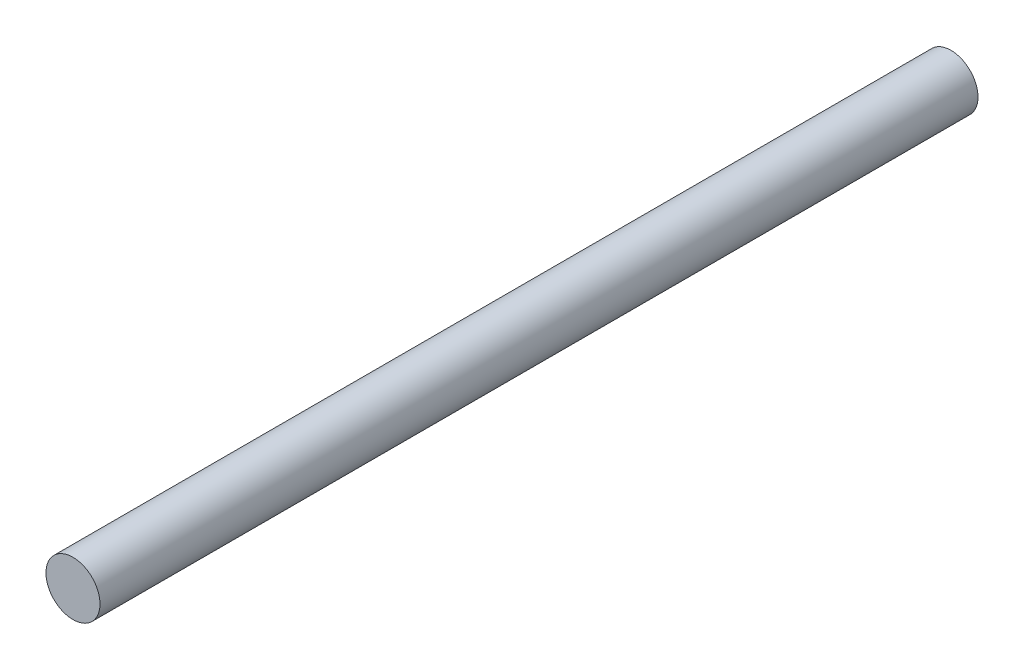
ISO-10303-21;
HEADER;
FILE_DESCRIPTION(('STEP AP214'),'2;1');
FILE_NAME('part.step','',(''),(''),'','','');
FILE_SCHEMA(('AUTOMOTIVE_DESIGN { 1 0 10303 214 1 1 1 1 }'));
ENDSEC;
DATA;
#1=APPLICATION_CONTEXT('core data for automotive mechanical design processes');
#2=APPLICATION_PROTOCOL_DEFINITION('international standard','automotive_design',2000,#1);
#3=PRODUCT_CONTEXT('',#1,'mechanical');
#4=PRODUCT('Part','Part','',(#3));
#5=PRODUCT_RELATED_PRODUCT_CATEGORY('part','',(#4));
#6=PRODUCT_DEFINITION_FORMATION('','',#4);
#7=PRODUCT_DEFINITION_CONTEXT('part definition',#1,'design');
#8=PRODUCT_DEFINITION('design','',#6,#7);
#9=PRODUCT_DEFINITION_SHAPE('','',#8);
#10=(LENGTH_UNIT() NAMED_UNIT(*) SI_UNIT(.MILLI.,.METRE.));
#11=(NAMED_UNIT(*) PLANE_ANGLE_UNIT() SI_UNIT($,.RADIAN.));
#12=(NAMED_UNIT(*) SI_UNIT($,.STERADIAN.) SOLID_ANGLE_UNIT());
#13=UNCERTAINTY_MEASURE_WITH_UNIT(LENGTH_MEASURE(1.E-05),#10,'distance_accuracy_value','');
#14=(GEOMETRIC_REPRESENTATION_CONTEXT(3) GLOBAL_UNCERTAINTY_ASSIGNED_CONTEXT((#13)) GLOBAL_UNIT_ASSIGNED_CONTEXT((#10,
#11,#12)) REPRESENTATION_CONTEXT('',''));
#15=CARTESIAN_POINT('',(0.,0.,0.));
#16=DIRECTION('',(0.,0.,1.));
#17=DIRECTION('',(1.,0.,0.));
#18=AXIS2_PLACEMENT_3D('',#15,#16,#17);
#19=CARTESIAN_POINT('',(0.,0.,130.));
#20=DIRECTION('',(0.,0.,-1.));
#21=DIRECTION('',(-1.,0.,0.));
#22=AXIS2_PLACEMENT_3D('',#19,#20,#21);
#23=CYLINDRICAL_SURFACE('',#22,4.);
#24=CARTESIAN_POINT('',(0.,0.,130.));
#25=DIRECTION('',(0.,0.,1.));
#26=DIRECTION('',(1.,0.,0.));
#27=AXIS2_PLACEMENT_3D('',#24,#25,#26);
#28=CIRCLE('',#27,4.);
#29=CARTESIAN_POINT('',(4.,0.,130.));
#30=VERTEX_POINT('',#29);
#31=EDGE_CURVE('E10',#30,#30,#28,.T.);
#32=ORIENTED_EDGE('',*,*,#31,.F.);
#33=EDGE_LOOP('',(#32));
#34=FACE_BOUND('',#33,.T.);
#35=CARTESIAN_POINT('',(0.,0.,0.));
#36=DIRECTION('',(0.,0.,1.));
#37=DIRECTION('',(1.,0.,0.));
#38=AXIS2_PLACEMENT_3D('',#35,#36,#37);
#39=CIRCLE('',#38,4.);
#40=CARTESIAN_POINT('',(4.,0.,0.));
#41=VERTEX_POINT('',#40);
#42=EDGE_CURVE('E36',#41,#41,#39,.T.);
#43=ORIENTED_EDGE('',*,*,#42,.T.);
#44=EDGE_LOOP('',(#43));
#45=FACE_BOUND('',#44,.T.);
#46=ADVANCED_FACE('F33',(#34,#45),#23,.T.);
#47=CARTESIAN_POINT('',(0.,0.,130.));
#48=DIRECTION('',(0.,0.,1.));
#49=DIRECTION('',(1.,0.,0.));
#50=AXIS2_PLACEMENT_3D('',#47,#48,#49);
#51=PLANE('',#50);
#52=ORIENTED_EDGE('',*,*,#31,.T.);
#53=EDGE_LOOP('',(#52));
#54=FACE_BOUND('',#53,.T.);
#55=ADVANCED_FACE('F48',(#54),#51,.T.);
#56=CARTESIAN_POINT('',(0.,0.,0.));
#57=DIRECTION('',(0.,0.,1.));
#58=DIRECTION('',(1.,0.,0.));
#59=AXIS2_PLACEMENT_3D('',#56,#57,#58);
#60=PLANE('',#59);
#61=ORIENTED_EDGE('',*,*,#42,.F.);
#62=EDGE_LOOP('',(#61));
#63=FACE_BOUND('',#62,.T.);
#64=ADVANCED_FACE('F46',(#63),#60,.F.);
#65=CLOSED_SHELL('',(#46,#55,#64));
#66=MANIFOLD_SOLID_BREP('B2',#65);
#67=ADVANCED_BREP_SHAPE_REPRESENTATION('',(#18,#66),#14);
#68=SHAPE_DEFINITION_REPRESENTATION(#9,#67);
ENDSEC;
END-ISO-10303-21;
